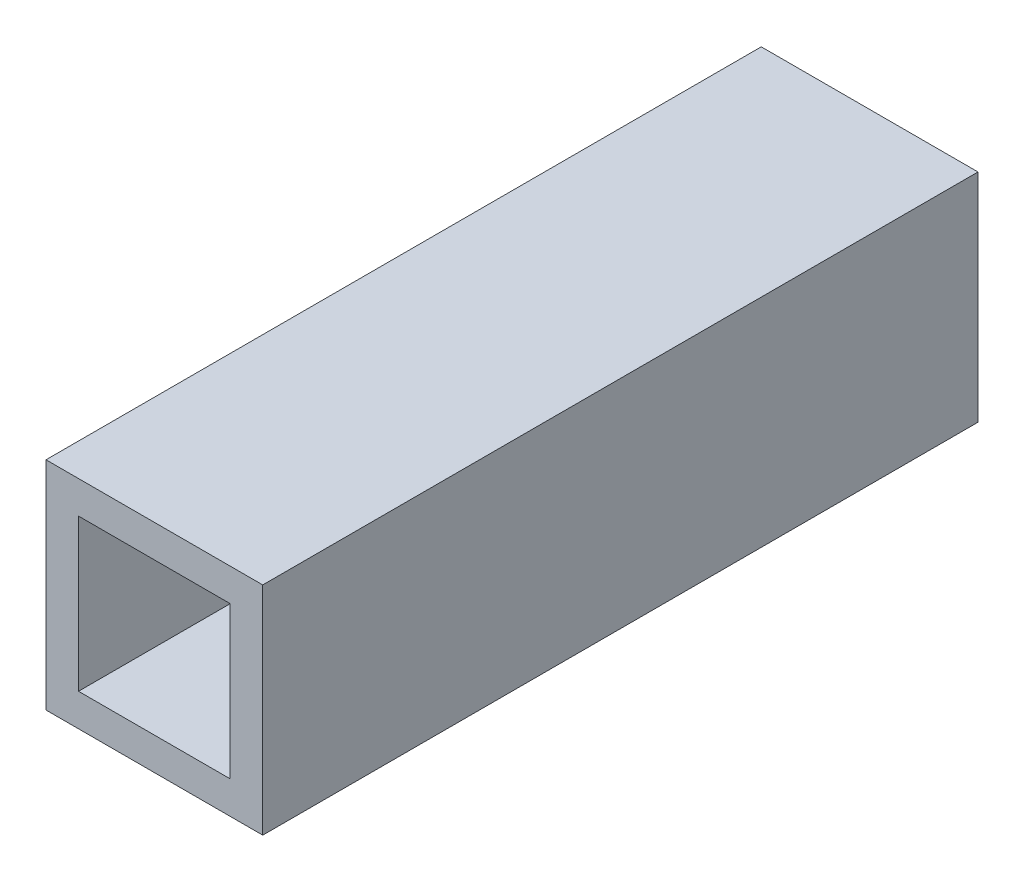
ISO-10303-21;
HEADER;
FILE_DESCRIPTION(('STEP AP214'),'2;1');
FILE_NAME('part.step','',(''),(''),'','','');
FILE_SCHEMA(('AUTOMOTIVE_DESIGN { 1 0 10303 214 1 1 1 1 }'));
ENDSEC;
DATA;
#1=APPLICATION_CONTEXT('core data for automotive mechanical design processes');
#2=APPLICATION_PROTOCOL_DEFINITION('international standard','automotive_design',2000,#1);
#3=PRODUCT_CONTEXT('',#1,'mechanical');
#4=PRODUCT('Part','Part','',(#3));
#5=PRODUCT_RELATED_PRODUCT_CATEGORY('part','',(#4));
#6=PRODUCT_DEFINITION_FORMATION('','',#4);
#7=PRODUCT_DEFINITION_CONTEXT('part definition',#1,'design');
#8=PRODUCT_DEFINITION('design','',#6,#7);
#9=PRODUCT_DEFINITION_SHAPE('','',#8);
#10=(LENGTH_UNIT() NAMED_UNIT(*) SI_UNIT(.MILLI.,.METRE.));
#11=(NAMED_UNIT(*) PLANE_ANGLE_UNIT() SI_UNIT($,.RADIAN.));
#12=(NAMED_UNIT(*) SI_UNIT($,.STERADIAN.) SOLID_ANGLE_UNIT());
#13=UNCERTAINTY_MEASURE_WITH_UNIT(LENGTH_MEASURE(1.E-05),#10,'distance_accuracy_value','');
#14=(GEOMETRIC_REPRESENTATION_CONTEXT(3) GLOBAL_UNCERTAINTY_ASSIGNED_CONTEXT((#13)) GLOBAL_UNIT_ASSIGNED_CONTEXT((#10,
#11,#12)) REPRESENTATION_CONTEXT('',''));
#15=CARTESIAN_POINT('',(0.,0.,0.));
#16=DIRECTION('',(0.,0.,1.));
#17=DIRECTION('',(1.,0.,0.));
#18=AXIS2_PLACEMENT_3D('',#15,#16,#17);
#19=CARTESIAN_POINT('',(0.,0.,66.));
#20=DIRECTION('',(0.,0.,-1.));
#21=DIRECTION('',(-1.,0.,0.));
#22=AXIS2_PLACEMENT_3D('',#19,#20,#21);
#23=PLANE('',#22);
#24=DIRECTION('',(0.,-1.,0.));
#25=VECTOR('',#24,1.);
#26=CARTESIAN_POINT('',(0.,0.,66.));
#27=LINE('',#26,#25);
#28=CARTESIAN_POINT('',(0.,20.,66.));
#29=VERTEX_POINT('',#28);
#30=CARTESIAN_POINT('',(0.,0.,66.));
#31=VERTEX_POINT('',#30);
#32=EDGE_CURVE('E141',#29,#31,#27,.T.);
#33=ORIENTED_EDGE('',*,*,#32,.T.);
#34=DIRECTION('',(1.,0.,0.));
#35=VECTOR('',#34,1.);
#36=CARTESIAN_POINT('',(0.,0.,66.));
#37=LINE('',#36,#35);
#38=CARTESIAN_POINT('',(20.,0.,66.));
#39=VERTEX_POINT('',#38);
#40=EDGE_CURVE('E85',#31,#39,#37,.T.);
#41=ORIENTED_EDGE('',*,*,#40,.T.);
#42=DIRECTION('',(0.,1.,0.));
#43=VECTOR('',#42,1.);
#44=CARTESIAN_POINT('',(20.,0.,66.));
#45=LINE('',#44,#43);
#46=CARTESIAN_POINT('',(20.,20.,66.));
#47=VERTEX_POINT('',#46);
#48=EDGE_CURVE('E144',#39,#47,#45,.T.);
#49=ORIENTED_EDGE('',*,*,#48,.T.);
#50=DIRECTION('',(-1.,0.,0.));
#51=VECTOR('',#50,1.);
#52=CARTESIAN_POINT('',(0.,20.,66.));
#53=LINE('',#52,#51);
#54=EDGE_CURVE('E57',#47,#29,#53,.T.);
#55=ORIENTED_EDGE('',*,*,#54,.T.);
#56=EDGE_LOOP('',(#33,#41,#49,#55));
#57=FACE_BOUND('',#56,.T.);
#58=DIRECTION('',(0.,-1.,0.));
#59=VECTOR('',#58,1.);
#60=CARTESIAN_POINT('',(3.,0.,66.));
#61=LINE('',#60,#59);
#62=CARTESIAN_POINT('',(3.,17.,66.));
#63=VERTEX_POINT('',#62);
#64=CARTESIAN_POINT('',(3.,3.,66.));
#65=VERTEX_POINT('',#64);
#66=EDGE_CURVE('E130',#63,#65,#61,.T.);
#67=ORIENTED_EDGE('',*,*,#66,.F.);
#68=DIRECTION('',(-1.,0.,0.));
#69=VECTOR('',#68,1.);
#70=CARTESIAN_POINT('',(0.,17.,66.));
#71=LINE('',#70,#69);
#72=CARTESIAN_POINT('',(17.,17.,66.));
#73=VERTEX_POINT('',#72);
#74=EDGE_CURVE('E139',#73,#63,#71,.T.);
#75=ORIENTED_EDGE('',*,*,#74,.F.);
#76=DIRECTION('',(0.,1.,0.));
#77=VECTOR('',#76,1.);
#78=CARTESIAN_POINT('',(17.,0.,66.));
#79=LINE('',#78,#77);
#80=CARTESIAN_POINT('',(17.,3.,66.));
#81=VERTEX_POINT('',#80);
#82=EDGE_CURVE('E137',#81,#73,#79,.T.);
#83=ORIENTED_EDGE('',*,*,#82,.F.);
#84=DIRECTION('',(1.,0.,0.));
#85=VECTOR('',#84,1.);
#86=CARTESIAN_POINT('',(0.,3.,66.));
#87=LINE('',#86,#85);
#88=EDGE_CURVE('E122',#65,#81,#87,.T.);
#89=ORIENTED_EDGE('',*,*,#88,.F.);
#90=EDGE_LOOP('',(#67,#75,#83,#89));
#91=FACE_BOUND('',#90,.T.);
#92=ADVANCED_FACE('F33',(#57,#91),#23,.F.);
#93=CARTESIAN_POINT('',(0.,0.,66.));
#94=DIRECTION('',(1.,0.,0.));
#95=DIRECTION('',(0.,1.,0.));
#96=AXIS2_PLACEMENT_3D('',#93,#94,#95);
#97=PLANE('',#96);
#98=DIRECTION('',(0.,-1.,0.));
#99=VECTOR('',#98,1.);
#100=CARTESIAN_POINT('',(0.,0.,0.));
#101=LINE('',#100,#99);
#102=CARTESIAN_POINT('',(0.,20.,0.));
#103=VERTEX_POINT('',#102);
#104=CARTESIAN_POINT('',(0.,0.,0.));
#105=VERTEX_POINT('',#104);
#106=EDGE_CURVE('E148',#103,#105,#101,.T.);
#107=ORIENTED_EDGE('',*,*,#106,.T.);
#108=DIRECTION('',(0.,0.,-1.));
#109=VECTOR('',#108,1.);
#110=CARTESIAN_POINT('',(0.,0.,66.));
#111=LINE('',#110,#109);
#112=EDGE_CURVE('E11',#31,#105,#111,.T.);
#113=ORIENTED_EDGE('',*,*,#112,.F.);
#114=ORIENTED_EDGE('',*,*,#32,.F.);
#115=DIRECTION('',(0.,0.,-1.));
#116=VECTOR('',#115,1.);
#117=CARTESIAN_POINT('',(0.,20.,66.));
#118=LINE('',#117,#116);
#119=EDGE_CURVE('E147',#29,#103,#118,.T.);
#120=ORIENTED_EDGE('',*,*,#119,.T.);
#121=EDGE_LOOP('',(#107,#113,#114,#120));
#122=FACE_BOUND('',#121,.T.);
#123=ADVANCED_FACE('F35',(#122),#97,.F.);
#124=CARTESIAN_POINT('',(0.,0.,66.));
#125=DIRECTION('',(0.,1.,0.));
#126=DIRECTION('',(0.,0.,1.));
#127=AXIS2_PLACEMENT_3D('',#124,#125,#126);
#128=PLANE('',#127);
#129=DIRECTION('',(1.,0.,0.));
#130=VECTOR('',#129,1.);
#131=CARTESIAN_POINT('',(0.,0.,0.));
#132=LINE('',#131,#130);
#133=CARTESIAN_POINT('',(20.,0.,0.));
#134=VERTEX_POINT('',#133);
#135=EDGE_CURVE('E151',#105,#134,#132,.T.);
#136=ORIENTED_EDGE('',*,*,#135,.T.);
#137=DIRECTION('',(0.,0.,-1.));
#138=VECTOR('',#137,1.);
#139=CARTESIAN_POINT('',(20.,0.,66.));
#140=LINE('',#139,#138);
#141=EDGE_CURVE('E41',#39,#134,#140,.T.);
#142=ORIENTED_EDGE('',*,*,#141,.F.);
#143=ORIENTED_EDGE('',*,*,#40,.F.);
#144=ORIENTED_EDGE('',*,*,#112,.T.);
#145=EDGE_LOOP('',(#136,#142,#143,#144));
#146=FACE_BOUND('',#145,.T.);
#147=ADVANCED_FACE('F179',(#146),#128,.F.);
#148=CARTESIAN_POINT('',(20.,0.,66.));
#149=DIRECTION('',(-1.,0.,0.));
#150=DIRECTION('',(0.,-1.,0.));
#151=AXIS2_PLACEMENT_3D('',#148,#149,#150);
#152=PLANE('',#151);
#153=DIRECTION('',(0.,1.,0.));
#154=VECTOR('',#153,1.);
#155=CARTESIAN_POINT('',(20.,0.,0.));
#156=LINE('',#155,#154);
#157=CARTESIAN_POINT('',(20.,20.,0.));
#158=VERTEX_POINT('',#157);
#159=EDGE_CURVE('E153',#134,#158,#156,.T.);
#160=ORIENTED_EDGE('',*,*,#159,.T.);
#161=DIRECTION('',(0.,0.,-1.));
#162=VECTOR('',#161,1.);
#163=CARTESIAN_POINT('',(20.,20.,66.));
#164=LINE('',#163,#162);
#165=EDGE_CURVE('E157',#47,#158,#164,.T.);
#166=ORIENTED_EDGE('',*,*,#165,.F.);
#167=ORIENTED_EDGE('',*,*,#48,.F.);
#168=ORIENTED_EDGE('',*,*,#141,.T.);
#169=EDGE_LOOP('',(#160,#166,#167,#168));
#170=FACE_BOUND('',#169,.T.);
#171=ADVANCED_FACE('F162',(#170),#152,.F.);
#172=CARTESIAN_POINT('',(0.,20.,66.));
#173=DIRECTION('',(0.,-1.,0.));
#174=DIRECTION('',(0.,0.,-1.));
#175=AXIS2_PLACEMENT_3D('',#172,#173,#174);
#176=PLANE('',#175);
#177=DIRECTION('',(-1.,0.,0.));
#178=VECTOR('',#177,1.);
#179=CARTESIAN_POINT('',(0.,20.,0.));
#180=LINE('',#179,#178);
#181=EDGE_CURVE('E78',#158,#103,#180,.T.);
#182=ORIENTED_EDGE('',*,*,#181,.T.);
#183=ORIENTED_EDGE('',*,*,#119,.F.);
#184=ORIENTED_EDGE('',*,*,#54,.F.);
#185=ORIENTED_EDGE('',*,*,#165,.T.);
#186=EDGE_LOOP('',(#182,#183,#184,#185));
#187=FACE_BOUND('',#186,.T.);
#188=ADVANCED_FACE('F170',(#187),#176,.F.);
#189=CARTESIAN_POINT('',(0.,0.,0.));
#190=DIRECTION('',(0.,0.,-1.));
#191=DIRECTION('',(-1.,0.,0.));
#192=AXIS2_PLACEMENT_3D('',#189,#190,#191);
#193=PLANE('',#192);
#194=ORIENTED_EDGE('',*,*,#106,.F.);
#195=ORIENTED_EDGE('',*,*,#181,.F.);
#196=ORIENTED_EDGE('',*,*,#159,.F.);
#197=ORIENTED_EDGE('',*,*,#135,.F.);
#198=EDGE_LOOP('',(#194,#195,#196,#197));
#199=FACE_BOUND('',#198,.T.);
#200=ADVANCED_FACE('F166',(#199),#193,.T.);
#201=CARTESIAN_POINT('',(3.,0.,66.));
#202=DIRECTION('',(1.,0.,0.));
#203=DIRECTION('',(0.,1.,0.));
#204=AXIS2_PLACEMENT_3D('',#201,#202,#203);
#205=PLANE('',#204);
#206=DIRECTION('',(0.,-1.,0.));
#207=VECTOR('',#206,1.);
#208=CARTESIAN_POINT('',(3.,0.,3.));
#209=LINE('',#208,#207);
#210=CARTESIAN_POINT('',(3.,17.,3.));
#211=VERTEX_POINT('',#210);
#212=CARTESIAN_POINT('',(3.,3.,3.));
#213=VERTEX_POINT('',#212);
#214=EDGE_CURVE('E113',#211,#213,#209,.T.);
#215=ORIENTED_EDGE('',*,*,#214,.F.);
#216=DIRECTION('',(0.,0.,-1.));
#217=VECTOR('',#216,1.);
#218=CARTESIAN_POINT('',(3.,17.,66.));
#219=LINE('',#218,#217);
#220=EDGE_CURVE('E133',#63,#211,#219,.T.);
#221=ORIENTED_EDGE('',*,*,#220,.F.);
#222=ORIENTED_EDGE('',*,*,#66,.T.);
#223=DIRECTION('',(0.,0.,-1.));
#224=VECTOR('',#223,1.);
#225=CARTESIAN_POINT('',(3.,3.,66.));
#226=LINE('',#225,#224);
#227=EDGE_CURVE('E125',#65,#213,#226,.T.);
#228=ORIENTED_EDGE('',*,*,#227,.T.);
#229=EDGE_LOOP('',(#215,#221,#222,#228));
#230=FACE_BOUND('',#229,.T.);
#231=ADVANCED_FACE('F177',(#230),#205,.T.);
#232=CARTESIAN_POINT('',(0.,3.,66.));
#233=DIRECTION('',(0.,1.,0.));
#234=DIRECTION('',(0.,0.,1.));
#235=AXIS2_PLACEMENT_3D('',#232,#233,#234);
#236=PLANE('',#235);
#237=DIRECTION('',(1.,0.,0.));
#238=VECTOR('',#237,1.);
#239=CARTESIAN_POINT('',(0.,3.,3.));
#240=LINE('',#239,#238);
#241=CARTESIAN_POINT('',(17.,3.,3.));
#242=VERTEX_POINT('',#241);
#243=EDGE_CURVE('E107',#213,#242,#240,.T.);
#244=ORIENTED_EDGE('',*,*,#243,.F.);
#245=ORIENTED_EDGE('',*,*,#227,.F.);
#246=ORIENTED_EDGE('',*,*,#88,.T.);
#247=DIRECTION('',(0.,0.,-1.));
#248=VECTOR('',#247,1.);
#249=CARTESIAN_POINT('',(17.,3.,66.));
#250=LINE('',#249,#248);
#251=EDGE_CURVE('E119',#81,#242,#250,.T.);
#252=ORIENTED_EDGE('',*,*,#251,.T.);
#253=EDGE_LOOP('',(#244,#245,#246,#252));
#254=FACE_BOUND('',#253,.T.);
#255=ADVANCED_FACE('F120',(#254),#236,.T.);
#256=CARTESIAN_POINT('',(17.,0.,66.));
#257=DIRECTION('',(-1.,0.,0.));
#258=DIRECTION('',(0.,-1.,0.));
#259=AXIS2_PLACEMENT_3D('',#256,#257,#258);
#260=PLANE('',#259);
#261=DIRECTION('',(0.,1.,0.));
#262=VECTOR('',#261,1.);
#263=CARTESIAN_POINT('',(17.,0.,3.));
#264=LINE('',#263,#262);
#265=CARTESIAN_POINT('',(17.,17.,3.));
#266=VERTEX_POINT('',#265);
#267=EDGE_CURVE('E111',#242,#266,#264,.T.);
#268=ORIENTED_EDGE('',*,*,#267,.F.);
#269=ORIENTED_EDGE('',*,*,#251,.F.);
#270=ORIENTED_EDGE('',*,*,#82,.T.);
#271=DIRECTION('',(0.,0.,-1.));
#272=VECTOR('',#271,1.);
#273=CARTESIAN_POINT('',(17.,17.,66.));
#274=LINE('',#273,#272);
#275=EDGE_CURVE('E48',#73,#266,#274,.T.);
#276=ORIENTED_EDGE('',*,*,#275,.T.);
#277=EDGE_LOOP('',(#268,#269,#270,#276));
#278=FACE_BOUND('',#277,.T.);
#279=ADVANCED_FACE('F127',(#278),#260,.T.);
#280=CARTESIAN_POINT('',(0.,17.,66.));
#281=DIRECTION('',(0.,-1.,0.));
#282=DIRECTION('',(0.,0.,-1.));
#283=AXIS2_PLACEMENT_3D('',#280,#281,#282);
#284=PLANE('',#283);
#285=DIRECTION('',(-1.,0.,0.));
#286=VECTOR('',#285,1.);
#287=CARTESIAN_POINT('',(0.,17.,3.));
#288=LINE('',#287,#286);
#289=EDGE_CURVE('E128',#266,#211,#288,.T.);
#290=ORIENTED_EDGE('',*,*,#289,.F.);
#291=ORIENTED_EDGE('',*,*,#275,.F.);
#292=ORIENTED_EDGE('',*,*,#74,.T.);
#293=ORIENTED_EDGE('',*,*,#220,.T.);
#294=EDGE_LOOP('',(#290,#291,#292,#293));
#295=FACE_BOUND('',#294,.T.);
#296=ADVANCED_FACE('F190',(#295),#284,.T.);
#297=CARTESIAN_POINT('',(0.,0.,3.));
#298=DIRECTION('',(0.,0.,-1.));
#299=DIRECTION('',(-1.,0.,0.));
#300=AXIS2_PLACEMENT_3D('',#297,#298,#299);
#301=PLANE('',#300);
#302=ORIENTED_EDGE('',*,*,#214,.T.);
#303=ORIENTED_EDGE('',*,*,#243,.T.);
#304=ORIENTED_EDGE('',*,*,#267,.T.);
#305=ORIENTED_EDGE('',*,*,#289,.T.);
#306=EDGE_LOOP('',(#302,#303,#304,#305));
#307=FACE_BOUND('',#306,.T.);
#308=ADVANCED_FACE('F109',(#307),#301,.F.);
#309=CLOSED_SHELL('',(#92,#123,#147,#171,#188,#200,#231,#255,#279,#296,#308));
#310=MANIFOLD_SOLID_BREP('B2',#309);
#311=ADVANCED_BREP_SHAPE_REPRESENTATION('',(#18,#310),#14);
#312=SHAPE_DEFINITION_REPRESENTATION(#9,#311);
ENDSEC;
END-ISO-10303-21;
